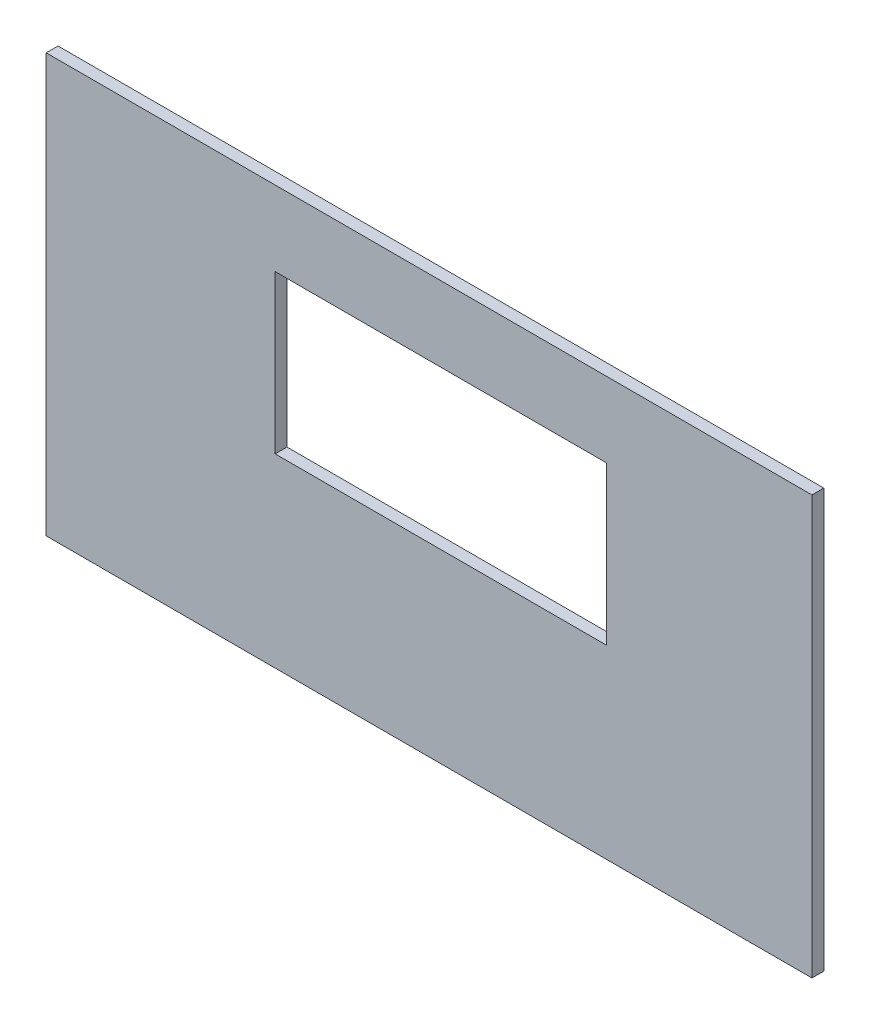
ISO-10303-21;
HEADER;
FILE_DESCRIPTION(('STEP AP214'),'2;1');
FILE_NAME('part.step','',(''),(''),'','','');
FILE_SCHEMA(('AUTOMOTIVE_DESIGN { 1 0 10303 214 1 1 1 1 }'));
ENDSEC;
DATA;
#1=APPLICATION_CONTEXT('core data for automotive mechanical design processes');
#2=APPLICATION_PROTOCOL_DEFINITION('international standard','automotive_design',2000,#1);
#3=PRODUCT_CONTEXT('',#1,'mechanical');
#4=PRODUCT('Part','Part','',(#3));
#5=PRODUCT_RELATED_PRODUCT_CATEGORY('part','',(#4));
#6=PRODUCT_DEFINITION_FORMATION('','',#4);
#7=PRODUCT_DEFINITION_CONTEXT('part definition',#1,'design');
#8=PRODUCT_DEFINITION('design','',#6,#7);
#9=PRODUCT_DEFINITION_SHAPE('','',#8);
#10=(LENGTH_UNIT() NAMED_UNIT(*) SI_UNIT(.MILLI.,.METRE.));
#11=(NAMED_UNIT(*) PLANE_ANGLE_UNIT() SI_UNIT($,.RADIAN.));
#12=(NAMED_UNIT(*) SI_UNIT($,.STERADIAN.) SOLID_ANGLE_UNIT());
#13=UNCERTAINTY_MEASURE_WITH_UNIT(LENGTH_MEASURE(1.E-05),#10,'distance_accuracy_value','');
#14=(GEOMETRIC_REPRESENTATION_CONTEXT(3) GLOBAL_UNCERTAINTY_ASSIGNED_CONTEXT((#13)) GLOBAL_UNIT_ASSIGNED_CONTEXT((#10,
#11,#12)) REPRESENTATION_CONTEXT('',''));
#15=CARTESIAN_POINT('',(0.,0.,0.));
#16=DIRECTION('',(0.,0.,1.));
#17=DIRECTION('',(1.,0.,0.));
#18=AXIS2_PLACEMENT_3D('',#15,#16,#17);
#19=CARTESIAN_POINT('',(0.,0.,3.));
#20=DIRECTION('',(0.,0.,-1.));
#21=DIRECTION('',(-1.,0.,0.));
#22=AXIS2_PLACEMENT_3D('',#19,#20,#21);
#23=PLANE('',#22);
#24=DIRECTION('',(0.,-1.,0.));
#25=VECTOR('',#24,1.);
#26=CARTESIAN_POINT('',(0.,0.,3.));
#27=LINE('',#26,#25);
#28=CARTESIAN_POINT('',(0.,106.,3.));
#29=VERTEX_POINT('',#28);
#30=CARTESIAN_POINT('',(0.,0.,3.));
#31=VERTEX_POINT('',#30);
#32=EDGE_CURVE('E139',#29,#31,#27,.T.);
#33=ORIENTED_EDGE('',*,*,#32,.T.);
#34=DIRECTION('',(1.,0.,0.));
#35=VECTOR('',#34,1.);
#36=CARTESIAN_POINT('',(0.,0.,3.));
#37=LINE('',#36,#35);
#38=CARTESIAN_POINT('',(194.,0.,3.));
#39=VERTEX_POINT('',#38);
#40=EDGE_CURVE('E142',#31,#39,#37,.T.);
#41=ORIENTED_EDGE('',*,*,#40,.T.);
#42=DIRECTION('',(0.,1.,0.));
#43=VECTOR('',#42,1.);
#44=CARTESIAN_POINT('',(194.,0.,3.));
#45=LINE('',#44,#43);
#46=CARTESIAN_POINT('',(194.,106.,3.));
#47=VERTEX_POINT('',#46);
#48=EDGE_CURVE('E147',#39,#47,#45,.T.);
#49=ORIENTED_EDGE('',*,*,#48,.T.);
#50=DIRECTION('',(-1.,0.,0.));
#51=VECTOR('',#50,1.);
#52=CARTESIAN_POINT('',(0.,106.,3.));
#53=LINE('',#52,#51);
#54=EDGE_CURVE('E149',#47,#29,#53,.T.);
#55=ORIENTED_EDGE('',*,*,#54,.T.);
#56=EDGE_LOOP('',(#33,#41,#49,#55));
#57=FACE_BOUND('',#56,.T.);
#58=DIRECTION('',(0.,-1.,0.));
#59=VECTOR('',#58,1.);
#60=CARTESIAN_POINT('',(58.,47.,3.));
#61=LINE('',#60,#59);
#62=CARTESIAN_POINT('',(58.,87.,3.));
#63=VERTEX_POINT('',#62);
#64=CARTESIAN_POINT('',(58.,47.,3.));
#65=VERTEX_POINT('',#64);
#66=EDGE_CURVE('E101',#63,#65,#61,.T.);
#67=ORIENTED_EDGE('',*,*,#66,.F.);
#68=DIRECTION('',(-1.,0.,0.));
#69=VECTOR('',#68,1.);
#70=CARTESIAN_POINT('',(58.,87.,3.));
#71=LINE('',#70,#69);
#72=CARTESIAN_POINT('',(142.,87.,3.));
#73=VERTEX_POINT('',#72);
#74=EDGE_CURVE('E128',#73,#63,#71,.T.);
#75=ORIENTED_EDGE('',*,*,#74,.F.);
#76=DIRECTION('',(0.,1.,0.));
#77=VECTOR('',#76,1.);
#78=CARTESIAN_POINT('',(142.,47.,3.));
#79=LINE('',#78,#77);
#80=CARTESIAN_POINT('',(142.,47.,3.));
#81=VERTEX_POINT('',#80);
#82=EDGE_CURVE('E125',#81,#73,#79,.T.);
#83=ORIENTED_EDGE('',*,*,#82,.F.);
#84=DIRECTION('',(1.,0.,0.));
#85=VECTOR('',#84,1.);
#86=CARTESIAN_POINT('',(58.,47.,3.));
#87=LINE('',#86,#85);
#88=EDGE_CURVE('E115',#65,#81,#87,.T.);
#89=ORIENTED_EDGE('',*,*,#88,.F.);
#90=EDGE_LOOP('',(#67,#75,#83,#89));
#91=FACE_BOUND('',#90,.T.);
#92=ADVANCED_FACE('F39',(#57,#91),#23,.F.);
#93=CARTESIAN_POINT('',(0.,0.,0.));
#94=DIRECTION('',(0.,0.,-1.));
#95=DIRECTION('',(-1.,0.,0.));
#96=AXIS2_PLACEMENT_3D('',#93,#94,#95);
#97=PLANE('',#96);
#98=DIRECTION('',(0.,-1.,0.));
#99=VECTOR('',#98,1.);
#100=CARTESIAN_POINT('',(0.,0.,0.));
#101=LINE('',#100,#99);
#102=CARTESIAN_POINT('',(0.,106.,0.));
#103=VERTEX_POINT('',#102);
#104=CARTESIAN_POINT('',(0.,0.,0.));
#105=VERTEX_POINT('',#104);
#106=EDGE_CURVE('E120',#103,#105,#101,.T.);
#107=ORIENTED_EDGE('',*,*,#106,.F.);
#108=DIRECTION('',(-1.,0.,0.));
#109=VECTOR('',#108,1.);
#110=CARTESIAN_POINT('',(0.,106.,0.));
#111=LINE('',#110,#109);
#112=CARTESIAN_POINT('',(194.,106.,0.));
#113=VERTEX_POINT('',#112);
#114=EDGE_CURVE('E143',#113,#103,#111,.T.);
#115=ORIENTED_EDGE('',*,*,#114,.F.);
#116=DIRECTION('',(0.,1.,0.));
#117=VECTOR('',#116,1.);
#118=CARTESIAN_POINT('',(194.,0.,0.));
#119=LINE('',#118,#117);
#120=CARTESIAN_POINT('',(194.,0.,0.));
#121=VERTEX_POINT('',#120);
#122=EDGE_CURVE('E155',#121,#113,#119,.T.);
#123=ORIENTED_EDGE('',*,*,#122,.F.);
#124=DIRECTION('',(1.,0.,0.));
#125=VECTOR('',#124,1.);
#126=CARTESIAN_POINT('',(0.,0.,0.));
#127=LINE('',#126,#125);
#128=EDGE_CURVE('E154',#105,#121,#127,.T.);
#129=ORIENTED_EDGE('',*,*,#128,.F.);
#130=EDGE_LOOP('',(#107,#115,#123,#129));
#131=FACE_BOUND('',#130,.T.);
#132=DIRECTION('',(-1.,0.,0.));
#133=VECTOR('',#132,1.);
#134=CARTESIAN_POINT('',(58.,87.,0.));
#135=LINE('',#134,#133);
#136=CARTESIAN_POINT('',(142.,87.,0.));
#137=VERTEX_POINT('',#136);
#138=CARTESIAN_POINT('',(58.,87.,0.));
#139=VERTEX_POINT('',#138);
#140=EDGE_CURVE('E111',#137,#139,#135,.T.);
#141=ORIENTED_EDGE('',*,*,#140,.T.);
#142=DIRECTION('',(0.,-1.,0.));
#143=VECTOR('',#142,1.);
#144=CARTESIAN_POINT('',(58.,47.,0.));
#145=LINE('',#144,#143);
#146=CARTESIAN_POINT('',(58.,47.,0.));
#147=VERTEX_POINT('',#146);
#148=EDGE_CURVE('E62',#139,#147,#145,.T.);
#149=ORIENTED_EDGE('',*,*,#148,.T.);
#150=DIRECTION('',(1.,0.,0.));
#151=VECTOR('',#150,1.);
#152=CARTESIAN_POINT('',(58.,47.,0.));
#153=LINE('',#152,#151);
#154=CARTESIAN_POINT('',(142.,47.,0.));
#155=VERTEX_POINT('',#154);
#156=EDGE_CURVE('E118',#147,#155,#153,.T.);
#157=ORIENTED_EDGE('',*,*,#156,.T.);
#158=DIRECTION('',(0.,1.,0.));
#159=VECTOR('',#158,1.);
#160=CARTESIAN_POINT('',(142.,47.,0.));
#161=LINE('',#160,#159);
#162=EDGE_CURVE('E135',#155,#137,#161,.T.);
#163=ORIENTED_EDGE('',*,*,#162,.T.);
#164=EDGE_LOOP('',(#141,#149,#157,#163));
#165=FACE_BOUND('',#164,.T.);
#166=ADVANCED_FACE('F171',(#131,#165),#97,.T.);
#167=CARTESIAN_POINT('',(0.,0.,3.));
#168=DIRECTION('',(1.,0.,0.));
#169=DIRECTION('',(0.,0.,-1.));
#170=AXIS2_PLACEMENT_3D('',#167,#168,#169);
#171=PLANE('',#170);
#172=ORIENTED_EDGE('',*,*,#106,.T.);
#173=DIRECTION('',(0.,0.,-1.));
#174=VECTOR('',#173,1.);
#175=CARTESIAN_POINT('',(0.,0.,3.));
#176=LINE('',#175,#174);
#177=EDGE_CURVE('E11',#31,#105,#176,.T.);
#178=ORIENTED_EDGE('',*,*,#177,.F.);
#179=ORIENTED_EDGE('',*,*,#32,.F.);
#180=DIRECTION('',(0.,0.,-1.));
#181=VECTOR('',#180,1.);
#182=CARTESIAN_POINT('',(0.,106.,3.));
#183=LINE('',#182,#181);
#184=EDGE_CURVE('E148',#29,#103,#183,.T.);
#185=ORIENTED_EDGE('',*,*,#184,.T.);
#186=EDGE_LOOP('',(#172,#178,#179,#185));
#187=FACE_BOUND('',#186,.T.);
#188=ADVANCED_FACE('F41',(#187),#171,.F.);
#189=CARTESIAN_POINT('',(0.,0.,3.));
#190=DIRECTION('',(0.,1.,0.));
#191=DIRECTION('',(0.,0.,1.));
#192=AXIS2_PLACEMENT_3D('',#189,#190,#191);
#193=PLANE('',#192);
#194=ORIENTED_EDGE('',*,*,#128,.T.);
#195=DIRECTION('',(0.,0.,-1.));
#196=VECTOR('',#195,1.);
#197=CARTESIAN_POINT('',(194.,0.,3.));
#198=LINE('',#197,#196);
#199=EDGE_CURVE('E50',#39,#121,#198,.T.);
#200=ORIENTED_EDGE('',*,*,#199,.F.);
#201=ORIENTED_EDGE('',*,*,#40,.F.);
#202=ORIENTED_EDGE('',*,*,#177,.T.);
#203=EDGE_LOOP('',(#194,#200,#201,#202));
#204=FACE_BOUND('',#203,.T.);
#205=ADVANCED_FACE('F183',(#204),#193,.F.);
#206=CARTESIAN_POINT('',(194.,0.,3.));
#207=DIRECTION('',(-1.,0.,0.));
#208=DIRECTION('',(0.,0.,1.));
#209=AXIS2_PLACEMENT_3D('',#206,#207,#208);
#210=PLANE('',#209);
#211=ORIENTED_EDGE('',*,*,#122,.T.);
#212=DIRECTION('',(0.,0.,-1.));
#213=VECTOR('',#212,1.);
#214=CARTESIAN_POINT('',(194.,106.,3.));
#215=LINE('',#214,#213);
#216=EDGE_CURVE('E158',#47,#113,#215,.T.);
#217=ORIENTED_EDGE('',*,*,#216,.F.);
#218=ORIENTED_EDGE('',*,*,#48,.F.);
#219=ORIENTED_EDGE('',*,*,#199,.T.);
#220=EDGE_LOOP('',(#211,#217,#218,#219));
#221=FACE_BOUND('',#220,.T.);
#222=ADVANCED_FACE('F167',(#221),#210,.F.);
#223=CARTESIAN_POINT('',(0.,106.,3.));
#224=DIRECTION('',(0.,-1.,0.));
#225=DIRECTION('',(0.,0.,-1.));
#226=AXIS2_PLACEMENT_3D('',#223,#224,#225);
#227=PLANE('',#226);
#228=ORIENTED_EDGE('',*,*,#114,.T.);
#229=ORIENTED_EDGE('',*,*,#184,.F.);
#230=ORIENTED_EDGE('',*,*,#54,.F.);
#231=ORIENTED_EDGE('',*,*,#216,.T.);
#232=EDGE_LOOP('',(#228,#229,#230,#231));
#233=FACE_BOUND('',#232,.T.);
#234=ADVANCED_FACE('F180',(#233),#227,.F.);
#235=CARTESIAN_POINT('',(58.,47.,3.));
#236=DIRECTION('',(1.,0.,0.));
#237=DIRECTION('',(0.,0.,-1.));
#238=AXIS2_PLACEMENT_3D('',#235,#236,#237);
#239=PLANE('',#238);
#240=ORIENTED_EDGE('',*,*,#148,.F.);
#241=DIRECTION('',(0.,0.,-1.));
#242=VECTOR('',#241,1.);
#243=CARTESIAN_POINT('',(58.,87.,3.));
#244=LINE('',#243,#242);
#245=EDGE_CURVE('E109',#63,#139,#244,.T.);
#246=ORIENTED_EDGE('',*,*,#245,.F.);
#247=ORIENTED_EDGE('',*,*,#66,.T.);
#248=DIRECTION('',(0.,0.,-1.));
#249=VECTOR('',#248,1.);
#250=CARTESIAN_POINT('',(58.,47.,3.));
#251=LINE('',#250,#249);
#252=EDGE_CURVE('E107',#65,#147,#251,.T.);
#253=ORIENTED_EDGE('',*,*,#252,.T.);
#254=EDGE_LOOP('',(#240,#246,#247,#253));
#255=FACE_BOUND('',#254,.T.);
#256=ADVANCED_FACE('F106',(#255),#239,.T.);
#257=CARTESIAN_POINT('',(58.,47.,3.));
#258=DIRECTION('',(0.,1.,0.));
#259=DIRECTION('',(0.,0.,1.));
#260=AXIS2_PLACEMENT_3D('',#257,#258,#259);
#261=PLANE('',#260);
#262=ORIENTED_EDGE('',*,*,#156,.F.);
#263=ORIENTED_EDGE('',*,*,#252,.F.);
#264=ORIENTED_EDGE('',*,*,#88,.T.);
#265=DIRECTION('',(0.,0.,-1.));
#266=VECTOR('',#265,1.);
#267=CARTESIAN_POINT('',(142.,47.,3.));
#268=LINE('',#267,#266);
#269=EDGE_CURVE('E123',#81,#155,#268,.T.);
#270=ORIENTED_EDGE('',*,*,#269,.T.);
#271=EDGE_LOOP('',(#262,#263,#264,#270));
#272=FACE_BOUND('',#271,.T.);
#273=ADVANCED_FACE('F116',(#272),#261,.T.);
#274=CARTESIAN_POINT('',(142.,47.,3.));
#275=DIRECTION('',(-1.,0.,0.));
#276=DIRECTION('',(0.,0.,1.));
#277=AXIS2_PLACEMENT_3D('',#274,#275,#276);
#278=PLANE('',#277);
#279=ORIENTED_EDGE('',*,*,#162,.F.);
#280=ORIENTED_EDGE('',*,*,#269,.F.);
#281=ORIENTED_EDGE('',*,*,#82,.T.);
#282=DIRECTION('',(0.,0.,-1.));
#283=VECTOR('',#282,1.);
#284=CARTESIAN_POINT('',(142.,87.,3.));
#285=LINE('',#284,#283);
#286=EDGE_CURVE('E53',#73,#137,#285,.T.);
#287=ORIENTED_EDGE('',*,*,#286,.T.);
#288=EDGE_LOOP('',(#279,#280,#281,#287));
#289=FACE_BOUND('',#288,.T.);
#290=ADVANCED_FACE('F206',(#289),#278,.T.);
#291=CARTESIAN_POINT('',(58.,87.,3.));
#292=DIRECTION('',(0.,-1.,0.));
#293=DIRECTION('',(0.,0.,-1.));
#294=AXIS2_PLACEMENT_3D('',#291,#292,#293);
#295=PLANE('',#294);
#296=ORIENTED_EDGE('',*,*,#140,.F.);
#297=ORIENTED_EDGE('',*,*,#286,.F.);
#298=ORIENTED_EDGE('',*,*,#74,.T.);
#299=ORIENTED_EDGE('',*,*,#245,.T.);
#300=EDGE_LOOP('',(#296,#297,#298,#299));
#301=FACE_BOUND('',#300,.T.);
#302=ADVANCED_FACE('F210',(#301),#295,.T.);
#303=CLOSED_SHELL('',(#92,#166,#188,#205,#222,#234,#256,#273,#290,#302));
#304=MANIFOLD_SOLID_BREP('B2',#303);
#305=ADVANCED_BREP_SHAPE_REPRESENTATION('',(#18,#304),#14);
#306=SHAPE_DEFINITION_REPRESENTATION(#9,#305);
ENDSEC;
END-ISO-10303-21;
